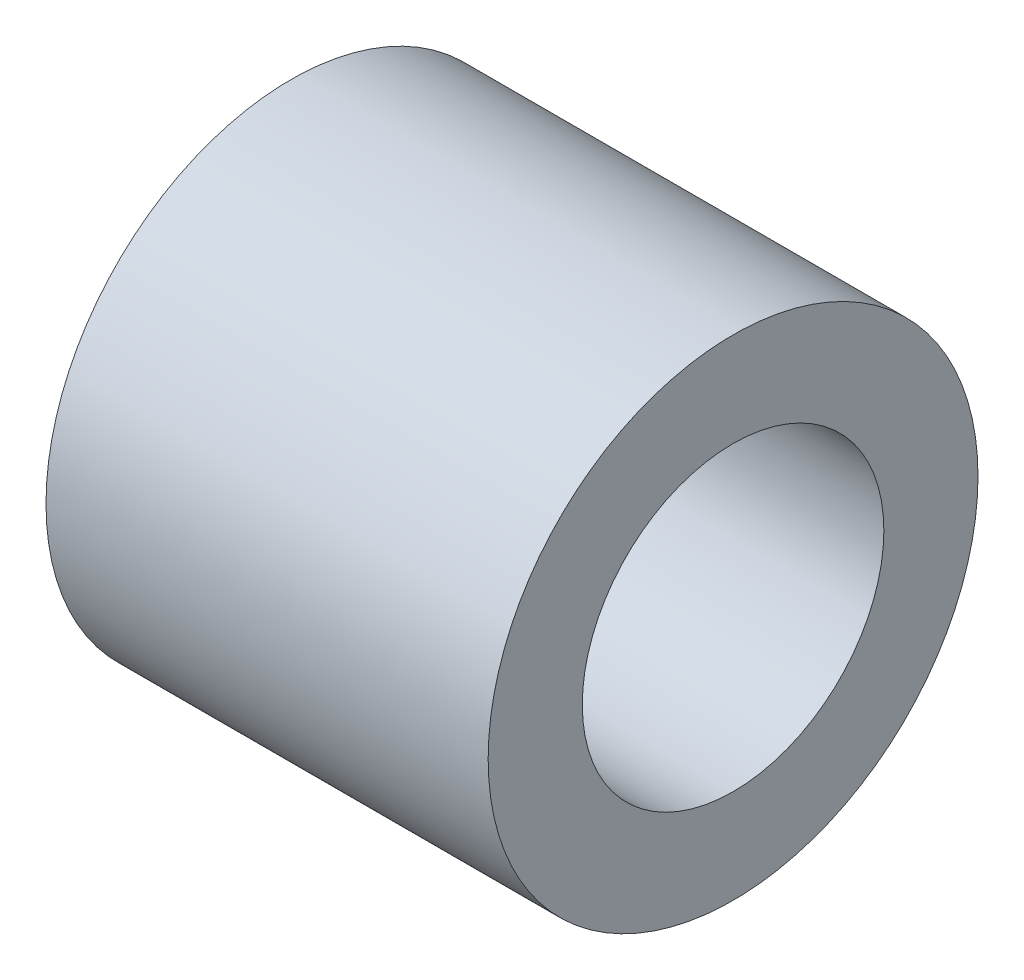
ISO-10303-21;
HEADER;
FILE_DESCRIPTION(('STEP AP214'),'2;1');
FILE_NAME('part.step','',(''),(''),'','','');
FILE_SCHEMA(('AUTOMOTIVE_DESIGN { 1 0 10303 214 1 1 1 1 }'));
ENDSEC;
DATA;
#1=APPLICATION_CONTEXT('core data for automotive mechanical design processes');
#2=APPLICATION_PROTOCOL_DEFINITION('international standard','automotive_design',2000,#1);
#3=PRODUCT_CONTEXT('',#1,'mechanical');
#4=PRODUCT('Part','Part','',(#3));
#5=PRODUCT_RELATED_PRODUCT_CATEGORY('part','',(#4));
#6=PRODUCT_DEFINITION_FORMATION('','',#4);
#7=PRODUCT_DEFINITION_CONTEXT('part definition',#1,'design');
#8=PRODUCT_DEFINITION('design','',#6,#7);
#9=PRODUCT_DEFINITION_SHAPE('','',#8);
#10=(LENGTH_UNIT() NAMED_UNIT(*) SI_UNIT(.MILLI.,.METRE.));
#11=(NAMED_UNIT(*) PLANE_ANGLE_UNIT() SI_UNIT($,.RADIAN.));
#12=(NAMED_UNIT(*) SI_UNIT($,.STERADIAN.) SOLID_ANGLE_UNIT());
#13=UNCERTAINTY_MEASURE_WITH_UNIT(LENGTH_MEASURE(1.E-05),#10,'distance_accuracy_value','');
#14=(GEOMETRIC_REPRESENTATION_CONTEXT(3) GLOBAL_UNCERTAINTY_ASSIGNED_CONTEXT((#13)) GLOBAL_UNIT_ASSIGNED_CONTEXT((#10,
#11,#12)) REPRESENTATION_CONTEXT('',''));
#15=CARTESIAN_POINT('',(0.,0.,0.));
#16=DIRECTION('',(0.,0.,1.));
#17=DIRECTION('',(1.,0.,0.));
#18=AXIS2_PLACEMENT_3D('',#15,#16,#17);
#19=CARTESIAN_POINT('',(4.45,0.,0.));
#20=DIRECTION('',(1.,0.,0.));
#21=DIRECTION('',(0.,0.,-1.));
#22=AXIS2_PLACEMENT_3D('',#19,#20,#21);
#23=PLANE('',#22);
#24=CARTESIAN_POINT('',(4.45,0.,0.));
#25=DIRECTION('',(1.,0.,0.));
#26=DIRECTION('',(0.,0.,-1.));
#27=AXIS2_PLACEMENT_3D('',#24,#25,#26);
#28=CIRCLE('',#27,4.93);
#29=CARTESIAN_POINT('',(4.45,0.,-4.93));
#30=VERTEX_POINT('',#29);
#31=EDGE_CURVE('E10',#30,#30,#28,.T.);
#32=ORIENTED_EDGE('',*,*,#31,.T.);
#33=EDGE_LOOP('',(#32));
#34=FACE_BOUND('',#33,.T.);
#35=CARTESIAN_POINT('',(4.45,0.,0.));
#36=DIRECTION('',(1.,0.,0.));
#37=DIRECTION('',(0.,0.,-1.));
#38=AXIS2_PLACEMENT_3D('',#35,#36,#37);
#39=CIRCLE('',#38,3.035);
#40=CARTESIAN_POINT('',(4.45,0.,-3.035));
#41=VERTEX_POINT('',#40);
#42=EDGE_CURVE('E41',#41,#41,#39,.T.);
#43=ORIENTED_EDGE('',*,*,#42,.F.);
#44=EDGE_LOOP('',(#43));
#45=FACE_BOUND('',#44,.T.);
#46=ADVANCED_FACE('F30',(#34,#45),#23,.T.);
#47=CARTESIAN_POINT('',(-4.45,0.,0.));
#48=DIRECTION('',(1.,0.,0.));
#49=DIRECTION('',(0.,0.,-1.));
#50=AXIS2_PLACEMENT_3D('',#47,#48,#49);
#51=PLANE('',#50);
#52=CARTESIAN_POINT('',(-4.45,0.,0.));
#53=DIRECTION('',(1.,0.,0.));
#54=DIRECTION('',(0.,0.,-1.));
#55=AXIS2_PLACEMENT_3D('',#52,#53,#54);
#56=CIRCLE('',#55,4.93);
#57=CARTESIAN_POINT('',(-4.45,0.,-4.93));
#58=VERTEX_POINT('',#57);
#59=EDGE_CURVE('E34',#58,#58,#56,.T.);
#60=ORIENTED_EDGE('',*,*,#59,.F.);
#61=EDGE_LOOP('',(#60));
#62=FACE_BOUND('',#61,.T.);
#63=CARTESIAN_POINT('',(-4.45,0.,0.));
#64=DIRECTION('',(1.,0.,0.));
#65=DIRECTION('',(0.,0.,-1.));
#66=AXIS2_PLACEMENT_3D('',#63,#64,#65);
#67=CIRCLE('',#66,3.035);
#68=CARTESIAN_POINT('',(-4.45,0.,-3.035));
#69=VERTEX_POINT('',#68);
#70=EDGE_CURVE('E43',#69,#69,#67,.T.);
#71=ORIENTED_EDGE('',*,*,#70,.T.);
#72=EDGE_LOOP('',(#71));
#73=FACE_BOUND('',#72,.T.);
#74=ADVANCED_FACE('F53',(#62,#73),#51,.F.);
#75=CARTESIAN_POINT('',(4.45,0.,0.));
#76=DIRECTION('',(-1.,0.,0.));
#77=DIRECTION('',(0.,0.,1.));
#78=AXIS2_PLACEMENT_3D('',#75,#76,#77);
#79=CYLINDRICAL_SURFACE('',#78,4.93);
#80=ORIENTED_EDGE('',*,*,#31,.F.);
#81=EDGE_LOOP('',(#80));
#82=FACE_BOUND('',#81,.T.);
#83=ORIENTED_EDGE('',*,*,#59,.T.);
#84=EDGE_LOOP('',(#83));
#85=FACE_BOUND('',#84,.T.);
#86=ADVANCED_FACE('F32',(#82,#85),#79,.T.);
#87=CARTESIAN_POINT('',(4.45,0.,0.));
#88=DIRECTION('',(-1.,0.,0.));
#89=DIRECTION('',(0.,0.,1.));
#90=AXIS2_PLACEMENT_3D('',#87,#88,#89);
#91=CYLINDRICAL_SURFACE('',#90,3.035);
#92=ORIENTED_EDGE('',*,*,#42,.T.);
#93=EDGE_LOOP('',(#92));
#94=FACE_BOUND('',#93,.T.);
#95=ORIENTED_EDGE('',*,*,#70,.F.);
#96=EDGE_LOOP('',(#95));
#97=FACE_BOUND('',#96,.T.);
#98=ADVANCED_FACE('F49',(#94,#97),#91,.F.);
#99=CLOSED_SHELL('',(#46,#74,#86,#98));
#100=MANIFOLD_SOLID_BREP('B2',#99);
#101=ADVANCED_BREP_SHAPE_REPRESENTATION('',(#18,#100),#14);
#102=SHAPE_DEFINITION_REPRESENTATION(#9,#101);
ENDSEC;
END-ISO-10303-21;
